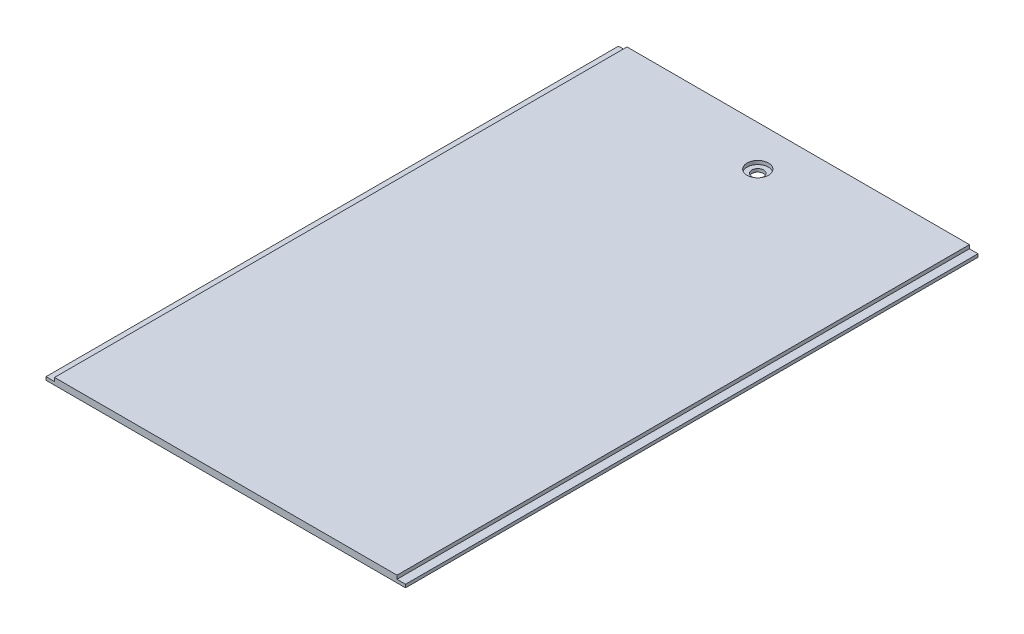
ISO-10303-21;
HEADER;
FILE_DESCRIPTION(('STEP AP214'),'2;1');
FILE_NAME('part.step','',(''),(''),'','','');
FILE_SCHEMA(('AUTOMOTIVE_DESIGN { 1 0 10303 214 1 1 1 1 }'));
ENDSEC;
DATA;
#1=APPLICATION_CONTEXT('core data for automotive mechanical design processes');
#2=APPLICATION_PROTOCOL_DEFINITION('international standard','automotive_design',2000,#1);
#3=PRODUCT_CONTEXT('',#1,'mechanical');
#4=PRODUCT('Part','Part','',(#3));
#5=PRODUCT_RELATED_PRODUCT_CATEGORY('part','',(#4));
#6=PRODUCT_DEFINITION_FORMATION('','',#4);
#7=PRODUCT_DEFINITION_CONTEXT('part definition',#1,'design');
#8=PRODUCT_DEFINITION('design','',#6,#7);
#9=PRODUCT_DEFINITION_SHAPE('','',#8);
#10=(LENGTH_UNIT() NAMED_UNIT(*) SI_UNIT(.MILLI.,.METRE.));
#11=(NAMED_UNIT(*) PLANE_ANGLE_UNIT() SI_UNIT($,.RADIAN.));
#12=(NAMED_UNIT(*) SI_UNIT($,.STERADIAN.) SOLID_ANGLE_UNIT());
#13=UNCERTAINTY_MEASURE_WITH_UNIT(LENGTH_MEASURE(1.E-05),#10,'distance_accuracy_value','');
#14=(GEOMETRIC_REPRESENTATION_CONTEXT(3) GLOBAL_UNCERTAINTY_ASSIGNED_CONTEXT((#13)) GLOBAL_UNIT_ASSIGNED_CONTEXT((#10,
#11,#12)) REPRESENTATION_CONTEXT('',''));
#15=CARTESIAN_POINT('',(0.,0.,0.));
#16=DIRECTION('',(0.,0.,1.));
#17=DIRECTION('',(1.,0.,0.));
#18=AXIS2_PLACEMENT_3D('',#15,#16,#17);
#19=CARTESIAN_POINT('',(0.,0.,-54.65));
#20=DIRECTION('',(0.,1.,0.));
#21=DIRECTION('',(0.,0.,1.));
#22=AXIS2_PLACEMENT_3D('',#19,#20,#21);
#23=CYLINDRICAL_SURFACE('',#22,1.3);
#24=CARTESIAN_POINT('',(0.,0.,-54.65));
#25=DIRECTION('',(0.,1.,0.));
#26=DIRECTION('',(0.,0.,1.));
#27=AXIS2_PLACEMENT_3D('',#24,#25,#26);
#28=CIRCLE('',#27,1.3);
#29=CARTESIAN_POINT('',(0.,0.,-53.35));
#30=VERTEX_POINT('',#29);
#31=EDGE_CURVE('E131',#30,#30,#28,.T.);
#32=CARTESIAN_POINT('',(0.,0.7,-54.65));
#33=DIRECTION('',(0.,1.,0.));
#34=DIRECTION('',(0.,0.,1.));
#35=AXIS2_PLACEMENT_3D('',#32,#33,#34);
#36=CIRCLE('',#35,1.3);
#37=CARTESIAN_POINT('',(0.,0.7,-53.35));
#38=VERTEX_POINT('',#37);
#39=EDGE_CURVE('E41',#38,#38,#36,.F.);
#40=CARTESIAN_POINT('',(0.,0.,-53.35));
#41=CARTESIAN_POINT('',(0.,0.00729166666666646,-53.35));
#42=CARTESIAN_POINT('',(0.,0.0145833333333331,-53.35));
#43=CARTESIAN_POINT('',(0.,0.0291666666666665,-53.35));
#44=CARTESIAN_POINT('',(0.,0.0364583333333331,-53.35));
#45=CARTESIAN_POINT('',(0.,0.0510416666666665,-53.35));
#46=CARTESIAN_POINT('',(0.,0.0583333333333331,-53.35));
#47=CARTESIAN_POINT('',(0.,0.0729166666666665,-53.35));
#48=CARTESIAN_POINT('',(0.,0.0802083333333331,-53.35));
#49=CARTESIAN_POINT('',(0.,0.0947916666666665,-53.35));
#50=CARTESIAN_POINT('',(0.,0.102083333333333,-53.35));
#51=CARTESIAN_POINT('',(0.,0.116666666666666,-53.35));
#52=CARTESIAN_POINT('',(0.,0.123958333333333,-53.35));
#53=CARTESIAN_POINT('',(0.,0.138541666666667,-53.35));
#54=CARTESIAN_POINT('',(0.,0.145833333333333,-53.35));
#55=CARTESIAN_POINT('',(0.,0.160416666666667,-53.35));
#56=CARTESIAN_POINT('',(0.,0.167708333333333,-53.35));
#57=CARTESIAN_POINT('',(0.,0.182291666666667,-53.35));
#58=CARTESIAN_POINT('',(0.,0.189583333333333,-53.35));
#59=CARTESIAN_POINT('',(0.,0.204166666666667,-53.35));
#60=CARTESIAN_POINT('',(0.,0.211458333333333,-53.35));
#61=CARTESIAN_POINT('',(0.,0.226041666666667,-53.35));
#62=CARTESIAN_POINT('',(0.,0.233333333333333,-53.35));
#63=CARTESIAN_POINT('',(0.,0.247916666666667,-53.35));
#64=CARTESIAN_POINT('',(0.,0.255208333333333,-53.35));
#65=CARTESIAN_POINT('',(0.,0.269791666666667,-53.35));
#66=CARTESIAN_POINT('',(0.,0.277083333333333,-53.35));
#67=CARTESIAN_POINT('',(0.,0.291666666666667,-53.35));
#68=CARTESIAN_POINT('',(0.,0.298958333333333,-53.35));
#69=CARTESIAN_POINT('',(0.,0.313541666666667,-53.35));
#70=CARTESIAN_POINT('',(0.,0.320833333333333,-53.35));
#71=CARTESIAN_POINT('',(0.,0.335416666666667,-53.35));
#72=CARTESIAN_POINT('',(0.,0.342708333333333,-53.35));
#73=CARTESIAN_POINT('',(0.,0.357291666666667,-53.35));
#74=CARTESIAN_POINT('',(0.,0.364583333333333,-53.35));
#75=CARTESIAN_POINT('',(0.,0.379166666666667,-53.35));
#76=CARTESIAN_POINT('',(0.,0.386458333333333,-53.35));
#77=CARTESIAN_POINT('',(0.,0.401041666666667,-53.35));
#78=CARTESIAN_POINT('',(0.,0.408333333333333,-53.35));
#79=CARTESIAN_POINT('',(0.,0.422916666666667,-53.35));
#80=CARTESIAN_POINT('',(0.,0.430208333333333,-53.35));
#81=CARTESIAN_POINT('',(0.,0.444791666666667,-53.35));
#82=CARTESIAN_POINT('',(0.,0.452083333333333,-53.35));
#83=CARTESIAN_POINT('',(0.,0.466666666666667,-53.35));
#84=CARTESIAN_POINT('',(0.,0.473958333333333,-53.35));
#85=CARTESIAN_POINT('',(0.,0.488541666666667,-53.35));
#86=CARTESIAN_POINT('',(0.,0.495833333333333,-53.35));
#87=CARTESIAN_POINT('',(0.,0.510416666666667,-53.35));
#88=CARTESIAN_POINT('',(0.,0.517708333333333,-53.35));
#89=CARTESIAN_POINT('',(0.,0.532291666666667,-53.35));
#90=CARTESIAN_POINT('',(0.,0.539583333333333,-53.35));
#91=CARTESIAN_POINT('',(0.,0.554166666666667,-53.35));
#92=CARTESIAN_POINT('',(0.,0.561458333333333,-53.35));
#93=CARTESIAN_POINT('',(0.,0.576041666666667,-53.35));
#94=CARTESIAN_POINT('',(0.,0.583333333333333,-53.35));
#95=CARTESIAN_POINT('',(0.,0.597916666666667,-53.35));
#96=CARTESIAN_POINT('',(0.,0.605208333333333,-53.35));
#97=CARTESIAN_POINT('',(0.,0.619791666666667,-53.35));
#98=CARTESIAN_POINT('',(0.,0.627083333333333,-53.35));
#99=CARTESIAN_POINT('',(0.,0.641666666666667,-53.35));
#100=CARTESIAN_POINT('',(0.,0.648958333333333,-53.35));
#101=CARTESIAN_POINT('',(0.,0.663541666666667,-53.35));
#102=CARTESIAN_POINT('',(0.,0.670833333333333,-53.35));
#103=CARTESIAN_POINT('',(0.,0.685416666666667,-53.35));
#104=CARTESIAN_POINT('',(0.,0.692708333333333,-53.35));
#105=CARTESIAN_POINT('',(0.,0.7,-53.35));
#106=B_SPLINE_CURVE_WITH_KNOTS('',3,(#40,#41,#42,#43,#44,#45,#46,#47,#48,#49,#50,#51,#52,#53,
#54,#55,#56,#57,#58,#59,#60,#61,#62,#63,#64,#65,#66,#67,#68,#69,#70,#71,#72,#73,#74,#75,#76,#77,
#78,#79,#80,#81,#82,#83,#84,#85,#86,#87,#88,#89,#90,#91,#92,#93,#94,#95,#96,#97,#98,#99,#100,
#101,#102,#103,#104,#105),.UNSPECIFIED.,.F.,.F.,(4,2,2,2,2,2,2,2,2,2,2,2,2,2,2,2,2,2,2,2,2,2,2,
2,2,2,2,2,2,2,2,2,4),(0.,0.021875,0.04375,0.065625,0.0875,0.109375,0.13125,0.153125,0.175,
0.196875,0.21875,0.240625,0.2625,0.284375,0.30625,0.328125,0.35,0.371875,0.39375,0.415625,
0.4375,0.459375,0.48125,0.503125,0.525,0.546875,0.56875,0.590625,0.6125,0.634375,0.65625,
0.678125,0.7),.UNSPECIFIED.);
#107=EDGE_CURVE('BSEAM37',#30,#38,#106,.T.);
#108=ORIENTED_EDGE('',*,*,#31,.F.);
#109=ORIENTED_EDGE('',*,*,#39,.F.);
#110=ORIENTED_EDGE('',*,*,#107,.T.);
#111=ORIENTED_EDGE('',*,*,#107,.F.);
#112=EDGE_LOOP('',(#108,#110,#109,#111));
#113=FACE_BOUND('',#112,.T.);
#114=ADVANCED_FACE('F37',(#113),#23,.F.);
#115=CARTESIAN_POINT('',(38.075,1.5,-63.65));
#116=DIRECTION('',(-1.,0.,0.));
#117=DIRECTION('',(0.,0.,1.));
#118=AXIS2_PLACEMENT_3D('',#115,#116,#117);
#119=PLANE('',#118);
#120=DIRECTION('',(0.,0.,1.));
#121=VECTOR('',#120,1.);
#122=CARTESIAN_POINT('',(38.075,0.700000000000009,-65.6748456731317));
#123=LINE('',#122,#121);
#124=CARTESIAN_POINT('',(38.075,0.700000000000009,-63.65));
#125=VERTEX_POINT('',#124);
#126=CARTESIAN_POINT('',(38.075,0.700000000000009,63.65));
#127=VERTEX_POINT('',#126);
#128=EDGE_CURVE('E53',#125,#127,#123,.T.);
#129=ORIENTED_EDGE('',*,*,#128,.F.);
#130=DIRECTION('',(0.,-1.,0.));
#131=VECTOR('',#130,1.);
#132=CARTESIAN_POINT('',(38.075,1.5,-63.65));
#133=LINE('',#132,#131);
#134=CARTESIAN_POINT('',(38.075,1.5,-63.65));
#135=VERTEX_POINT('',#134);
#136=EDGE_CURVE('E167',#135,#125,#133,.T.);
#137=ORIENTED_EDGE('',*,*,#136,.F.);
#138=DIRECTION('',(0.,0.,-1.));
#139=VECTOR('',#138,1.);
#140=CARTESIAN_POINT('',(38.075,1.5,-63.65));
#141=LINE('',#140,#139);
#142=CARTESIAN_POINT('',(38.075,1.5,63.65));
#143=VERTEX_POINT('',#142);
#144=EDGE_CURVE('E159',#143,#135,#141,.T.);
#145=ORIENTED_EDGE('',*,*,#144,.F.);
#146=DIRECTION('',(0.,-1.,0.));
#147=VECTOR('',#146,1.);
#148=CARTESIAN_POINT('',(38.075,1.5,63.65));
#149=LINE('',#148,#147);
#150=EDGE_CURVE('E46',#143,#127,#149,.T.);
#151=ORIENTED_EDGE('',*,*,#150,.T.);
#152=EDGE_LOOP('',(#129,#137,#145,#151));
#153=FACE_BOUND('',#152,.T.);
#154=ADVANCED_FACE('F171',(#153),#119,.F.);
#155=CARTESIAN_POINT('',(-38.075,1.5,-63.65));
#156=DIRECTION('',(1.,0.,0.));
#157=DIRECTION('',(0.,0.,-1.));
#158=AXIS2_PLACEMENT_3D('',#155,#156,#157);
#159=PLANE('',#158);
#160=DIRECTION('',(0.,-1.,0.));
#161=VECTOR('',#160,1.);
#162=CARTESIAN_POINT('',(-38.075,1.5,-63.65));
#163=LINE('',#162,#161);
#164=CARTESIAN_POINT('',(-38.075,1.5,-63.65));
#165=VERTEX_POINT('',#164);
#166=CARTESIAN_POINT('',(-38.075,0.7,-63.65));
#167=VERTEX_POINT('',#166);
#168=EDGE_CURVE('E162',#165,#167,#163,.T.);
#169=ORIENTED_EDGE('',*,*,#168,.T.);
#170=DIRECTION('',(0.,0.,1.));
#171=VECTOR('',#170,1.);
#172=CARTESIAN_POINT('',(-38.075,0.7,-65.6748456731317));
#173=LINE('',#172,#171);
#174=CARTESIAN_POINT('',(-38.075,0.7,63.65));
#175=VERTEX_POINT('',#174);
#176=EDGE_CURVE('E148',#167,#175,#173,.T.);
#177=ORIENTED_EDGE('',*,*,#176,.T.);
#178=DIRECTION('',(0.,-1.,0.));
#179=VECTOR('',#178,1.);
#180=CARTESIAN_POINT('',(-38.075,1.5,63.65));
#181=LINE('',#180,#179);
#182=CARTESIAN_POINT('',(-38.075,1.5,63.65));
#183=VERTEX_POINT('',#182);
#184=EDGE_CURVE('E11',#183,#175,#181,.T.);
#185=ORIENTED_EDGE('',*,*,#184,.F.);
#186=DIRECTION('',(0.,0.,1.));
#187=VECTOR('',#186,1.);
#188=CARTESIAN_POINT('',(-38.075,1.5,-63.65));
#189=LINE('',#188,#187);
#190=EDGE_CURVE('E154',#165,#183,#189,.T.);
#191=ORIENTED_EDGE('',*,*,#190,.F.);
#192=EDGE_LOOP('',(#169,#177,#185,#191));
#193=FACE_BOUND('',#192,.T.);
#194=ADVANCED_FACE('F39',(#193),#159,.F.);
#195=CARTESIAN_POINT('',(38.075,1.5,63.65));
#196=DIRECTION('',(0.,0.,-1.));
#197=DIRECTION('',(-1.,0.,0.));
#198=AXIS2_PLACEMENT_3D('',#195,#196,#197);
#199=PLANE('',#198);
#200=DIRECTION('',(1.,0.,0.));
#201=VECTOR('',#200,1.);
#202=CARTESIAN_POINT('',(38.075,0.,63.65));
#203=LINE('',#202,#201);
#204=CARTESIAN_POINT('',(-39.975,0.,63.65));
#205=VERTEX_POINT('',#204);
#206=CARTESIAN_POINT('',(39.975,0.,63.65));
#207=VERTEX_POINT('',#206);
#208=EDGE_CURVE('E105',#205,#207,#203,.T.);
#209=ORIENTED_EDGE('',*,*,#208,.T.);
#210=DIRECTION('',(0.,1.,0.));
#211=VECTOR('',#210,1.);
#212=CARTESIAN_POINT('',(39.975,0.,63.65));
#213=LINE('',#212,#211);
#214=CARTESIAN_POINT('',(39.975,0.70000000000001,63.65));
#215=VERTEX_POINT('',#214);
#216=EDGE_CURVE('E110',#207,#215,#213,.T.);
#217=ORIENTED_EDGE('',*,*,#216,.T.);
#218=DIRECTION('',(-1.,0.,0.));
#219=VECTOR('',#218,1.);
#220=CARTESIAN_POINT('',(38.075,0.700000000000009,63.65));
#221=LINE('',#220,#219);
#222=EDGE_CURVE('E127',#215,#127,#221,.T.);
#223=ORIENTED_EDGE('',*,*,#222,.T.);
#224=ORIENTED_EDGE('',*,*,#150,.F.);
#225=DIRECTION('',(1.,0.,0.));
#226=VECTOR('',#225,1.);
#227=CARTESIAN_POINT('',(38.075,1.5,63.65));
#228=LINE('',#227,#226);
#229=EDGE_CURVE('E157',#183,#143,#228,.T.);
#230=ORIENTED_EDGE('',*,*,#229,.F.);
#231=ORIENTED_EDGE('',*,*,#184,.T.);
#232=DIRECTION('',(-1.,0.,0.));
#233=VECTOR('',#232,1.);
#234=CARTESIAN_POINT('',(-38.075,0.7,63.65));
#235=LINE('',#234,#233);
#236=CARTESIAN_POINT('',(-39.975,0.7,63.65));
#237=VERTEX_POINT('',#236);
#238=EDGE_CURVE('E61',#175,#237,#235,.T.);
#239=ORIENTED_EDGE('',*,*,#238,.T.);
#240=DIRECTION('',(0.,-1.,0.));
#241=VECTOR('',#240,1.);
#242=CARTESIAN_POINT('',(-39.975,0.,63.65));
#243=LINE('',#242,#241);
#244=EDGE_CURVE('E113',#237,#205,#243,.T.);
#245=ORIENTED_EDGE('',*,*,#244,.T.);
#246=EDGE_LOOP('',(#209,#217,#223,#224,#230,#231,#239,#245));
#247=FACE_BOUND('',#246,.T.);
#248=ADVANCED_FACE('F107',(#247),#199,.F.);
#249=CARTESIAN_POINT('',(38.075,1.5,-63.65));
#250=DIRECTION('',(0.,0.,1.));
#251=DIRECTION('',(1.,0.,0.));
#252=AXIS2_PLACEMENT_3D('',#249,#250,#251);
#253=PLANE('',#252);
#254=DIRECTION('',(-1.,0.,0.));
#255=VECTOR('',#254,1.);
#256=CARTESIAN_POINT('',(38.075,0.,-63.65));
#257=LINE('',#256,#255);
#258=CARTESIAN_POINT('',(39.975,0.,-63.65));
#259=VERTEX_POINT('',#258);
#260=CARTESIAN_POINT('',(-39.975,0.,-63.65));
#261=VERTEX_POINT('',#260);
#262=EDGE_CURVE('E117',#259,#261,#257,.T.);
#263=ORIENTED_EDGE('',*,*,#262,.T.);
#264=DIRECTION('',(0.,1.,0.));
#265=VECTOR('',#264,1.);
#266=CARTESIAN_POINT('',(-39.975,0.,-63.65));
#267=LINE('',#266,#265);
#268=CARTESIAN_POINT('',(-39.975,0.7,-63.65));
#269=VERTEX_POINT('',#268);
#270=EDGE_CURVE('E143',#261,#269,#267,.T.);
#271=ORIENTED_EDGE('',*,*,#270,.T.);
#272=DIRECTION('',(1.,0.,0.));
#273=VECTOR('',#272,1.);
#274=CARTESIAN_POINT('',(-38.075,0.7,-63.65));
#275=LINE('',#274,#273);
#276=EDGE_CURVE('E118',#269,#167,#275,.T.);
#277=ORIENTED_EDGE('',*,*,#276,.T.);
#278=ORIENTED_EDGE('',*,*,#168,.F.);
#279=DIRECTION('',(-1.,0.,0.));
#280=VECTOR('',#279,1.);
#281=CARTESIAN_POINT('',(38.075,1.5,-63.65));
#282=LINE('',#281,#280);
#283=EDGE_CURVE('E161',#135,#165,#282,.T.);
#284=ORIENTED_EDGE('',*,*,#283,.F.);
#285=ORIENTED_EDGE('',*,*,#136,.T.);
#286=DIRECTION('',(1.,0.,0.));
#287=VECTOR('',#286,1.);
#288=CARTESIAN_POINT('',(38.075,0.700000000000009,-63.65));
#289=LINE('',#288,#287);
#290=CARTESIAN_POINT('',(39.975,0.70000000000001,-63.65));
#291=VERTEX_POINT('',#290);
#292=EDGE_CURVE('E137',#125,#291,#289,.T.);
#293=ORIENTED_EDGE('',*,*,#292,.T.);
#294=DIRECTION('',(0.,-1.,0.));
#295=VECTOR('',#294,1.);
#296=CARTESIAN_POINT('',(39.975,0.,-63.65));
#297=LINE('',#296,#295);
#298=EDGE_CURVE('E141',#291,#259,#297,.T.);
#299=ORIENTED_EDGE('',*,*,#298,.T.);
#300=EDGE_LOOP('',(#263,#271,#277,#278,#284,#285,#293,#299));
#301=FACE_BOUND('',#300,.T.);
#302=ADVANCED_FACE('F215',(#301),#253,.F.);
#303=CARTESIAN_POINT('',(0.,1.5,0.));
#304=DIRECTION('',(0.,-1.,0.));
#305=DIRECTION('',(0.,0.,-1.));
#306=AXIS2_PLACEMENT_3D('',#303,#304,#305);
#307=PLANE('',#306);
#308=CARTESIAN_POINT('',(0.,1.5,-54.65));
#309=DIRECTION('',(0.,1.,0.));
#310=DIRECTION('',(0.,0.,1.));
#311=AXIS2_PLACEMENT_3D('',#308,#309,#310);
#312=CIRCLE('',#311,2.375);
#313=CARTESIAN_POINT('',(0.,1.5,-52.275));
#314=VERTEX_POINT('',#313);
#315=EDGE_CURVE('E177',#314,#314,#312,.T.);
#316=ORIENTED_EDGE('',*,*,#315,.F.);
#317=EDGE_LOOP('',(#316));
#318=FACE_BOUND('',#317,.T.);
#319=ORIENTED_EDGE('',*,*,#190,.T.);
#320=ORIENTED_EDGE('',*,*,#229,.T.);
#321=ORIENTED_EDGE('',*,*,#144,.T.);
#322=ORIENTED_EDGE('',*,*,#283,.T.);
#323=EDGE_LOOP('',(#319,#320,#321,#322));
#324=FACE_BOUND('',#323,.T.);
#325=ADVANCED_FACE('F212',(#318,#324),#307,.F.);
#326=CARTESIAN_POINT('',(0.,0.,0.));
#327=DIRECTION('',(0.,-1.,0.));
#328=DIRECTION('',(0.,0.,-1.));
#329=AXIS2_PLACEMENT_3D('',#326,#327,#328);
#330=PLANE('',#329);
#331=ORIENTED_EDGE('',*,*,#31,.T.);
#332=EDGE_LOOP('',(#331));
#333=FACE_BOUND('',#332,.T.);
#334=ORIENTED_EDGE('',*,*,#208,.F.);
#335=DIRECTION('',(0.,0.,1.));
#336=VECTOR('',#335,1.);
#337=CARTESIAN_POINT('',(-39.975,0.,-65.6748456731317));
#338=LINE('',#337,#336);
#339=EDGE_CURVE('E145',#261,#205,#338,.T.);
#340=ORIENTED_EDGE('',*,*,#339,.F.);
#341=ORIENTED_EDGE('',*,*,#262,.F.);
#342=DIRECTION('',(0.,0.,1.));
#343=VECTOR('',#342,1.);
#344=CARTESIAN_POINT('',(39.975,0.,-65.6748456731317));
#345=LINE('',#344,#343);
#346=EDGE_CURVE('E121',#259,#207,#345,.T.);
#347=ORIENTED_EDGE('',*,*,#346,.T.);
#348=EDGE_LOOP('',(#334,#340,#341,#347));
#349=FACE_BOUND('',#348,.T.);
#350=ADVANCED_FACE('F122',(#333,#349),#330,.T.);
#351=CARTESIAN_POINT('',(-39.975,0.,-65.6748456731317));
#352=DIRECTION('',(-1.,0.,0.));
#353=DIRECTION('',(0.,0.,1.));
#354=AXIS2_PLACEMENT_3D('',#351,#352,#353);
#355=PLANE('',#354);
#356=ORIENTED_EDGE('',*,*,#270,.F.);
#357=ORIENTED_EDGE('',*,*,#339,.T.);
#358=ORIENTED_EDGE('',*,*,#244,.F.);
#359=DIRECTION('',(0.,0.,1.));
#360=VECTOR('',#359,1.);
#361=CARTESIAN_POINT('',(-39.975,0.7,-65.6748456731317));
#362=LINE('',#361,#360);
#363=EDGE_CURVE('E150',#269,#237,#362,.T.);
#364=ORIENTED_EDGE('',*,*,#363,.F.);
#365=EDGE_LOOP('',(#356,#357,#358,#364));
#366=FACE_BOUND('',#365,.T.);
#367=ADVANCED_FACE('F206',(#366),#355,.T.);
#368=CARTESIAN_POINT('',(-38.075,0.7,-65.6748456731317));
#369=DIRECTION('',(0.,1.,0.));
#370=DIRECTION('',(0.,0.,1.));
#371=AXIS2_PLACEMENT_3D('',#368,#369,#370);
#372=PLANE('',#371);
#373=ORIENTED_EDGE('',*,*,#276,.F.);
#374=ORIENTED_EDGE('',*,*,#363,.T.);
#375=ORIENTED_EDGE('',*,*,#238,.F.);
#376=ORIENTED_EDGE('',*,*,#176,.F.);
#377=EDGE_LOOP('',(#373,#374,#375,#376));
#378=FACE_BOUND('',#377,.T.);
#379=ADVANCED_FACE('F203',(#378),#372,.T.);
#380=CARTESIAN_POINT('',(38.075,0.700000000000009,-65.6748456731317));
#381=DIRECTION('',(0.,1.,0.));
#382=DIRECTION('',(-1.,0.,0.));
#383=AXIS2_PLACEMENT_3D('',#380,#381,#382);
#384=PLANE('',#383);
#385=ORIENTED_EDGE('',*,*,#292,.F.);
#386=ORIENTED_EDGE('',*,*,#128,.T.);
#387=ORIENTED_EDGE('',*,*,#222,.F.);
#388=DIRECTION('',(0.,0.,1.));
#389=VECTOR('',#388,1.);
#390=CARTESIAN_POINT('',(39.975,0.70000000000001,-65.6748456731317));
#391=LINE('',#390,#389);
#392=EDGE_CURVE('E126',#291,#215,#391,.T.);
#393=ORIENTED_EDGE('',*,*,#392,.F.);
#394=EDGE_LOOP('',(#385,#386,#387,#393));
#395=FACE_BOUND('',#394,.T.);
#396=ADVANCED_FACE('F174',(#395),#384,.T.);
#397=CARTESIAN_POINT('',(39.975,0.,-65.6748456731317));
#398=DIRECTION('',(1.,0.,0.));
#399=DIRECTION('',(0.,0.,-1.));
#400=AXIS2_PLACEMENT_3D('',#397,#398,#399);
#401=PLANE('',#400);
#402=ORIENTED_EDGE('',*,*,#298,.F.);
#403=ORIENTED_EDGE('',*,*,#392,.T.);
#404=ORIENTED_EDGE('',*,*,#216,.F.);
#405=ORIENTED_EDGE('',*,*,#346,.F.);
#406=EDGE_LOOP('',(#402,#403,#404,#405));
#407=FACE_BOUND('',#406,.T.);
#408=ADVANCED_FACE('F129',(#407),#401,.T.);
#409=CARTESIAN_POINT('',(0.,0.7,-54.65));
#410=DIRECTION('',(0.,1.,0.));
#411=DIRECTION('',(0.,0.,1.));
#412=AXIS2_PLACEMENT_3D('',#409,#410,#411);
#413=PLANE('',#412);
#414=CARTESIAN_POINT('',(0.,0.7,-54.65));
#415=DIRECTION('',(0.,1.,0.));
#416=DIRECTION('',(0.,0.,1.));
#417=AXIS2_PLACEMENT_3D('',#414,#415,#416);
#418=CIRCLE('',#417,2.375);
#419=CARTESIAN_POINT('',(0.,0.7,-52.275));
#420=VERTEX_POINT('',#419);
#421=EDGE_CURVE('E180',#420,#420,#418,.T.);
#422=ORIENTED_EDGE('',*,*,#421,.T.);
#423=EDGE_LOOP('',(#422));
#424=FACE_BOUND('',#423,.T.);
#425=ORIENTED_EDGE('',*,*,#39,.T.);
#426=EDGE_LOOP('',(#425));
#427=FACE_BOUND('',#426,.T.);
#428=ADVANCED_FACE('F187',(#424,#427),#413,.T.);
#429=CARTESIAN_POINT('',(0.,0.7,-54.65));
#430=DIRECTION('',(0.,1.,0.));
#431=DIRECTION('',(0.,0.,1.));
#432=AXIS2_PLACEMENT_3D('',#429,#430,#431);
#433=CYLINDRICAL_SURFACE('',#432,2.375);
#434=ORIENTED_EDGE('',*,*,#421,.F.);
#435=EDGE_LOOP('',(#434));
#436=FACE_BOUND('',#435,.T.);
#437=ORIENTED_EDGE('',*,*,#315,.T.);
#438=EDGE_LOOP('',(#437));
#439=FACE_BOUND('',#438,.T.);
#440=ADVANCED_FACE('F199',(#436,#439),#433,.F.);
#441=CLOSED_SHELL('',(#114,#154,#194,#248,#302,#325,#350,#367,#379,#396,#408,#428,#440));
#442=MANIFOLD_SOLID_BREP('B2',#441);
#443=ADVANCED_BREP_SHAPE_REPRESENTATION('',(#18,#442),#14);
#444=SHAPE_DEFINITION_REPRESENTATION(#9,#443);
ENDSEC;
END-ISO-10303-21;
